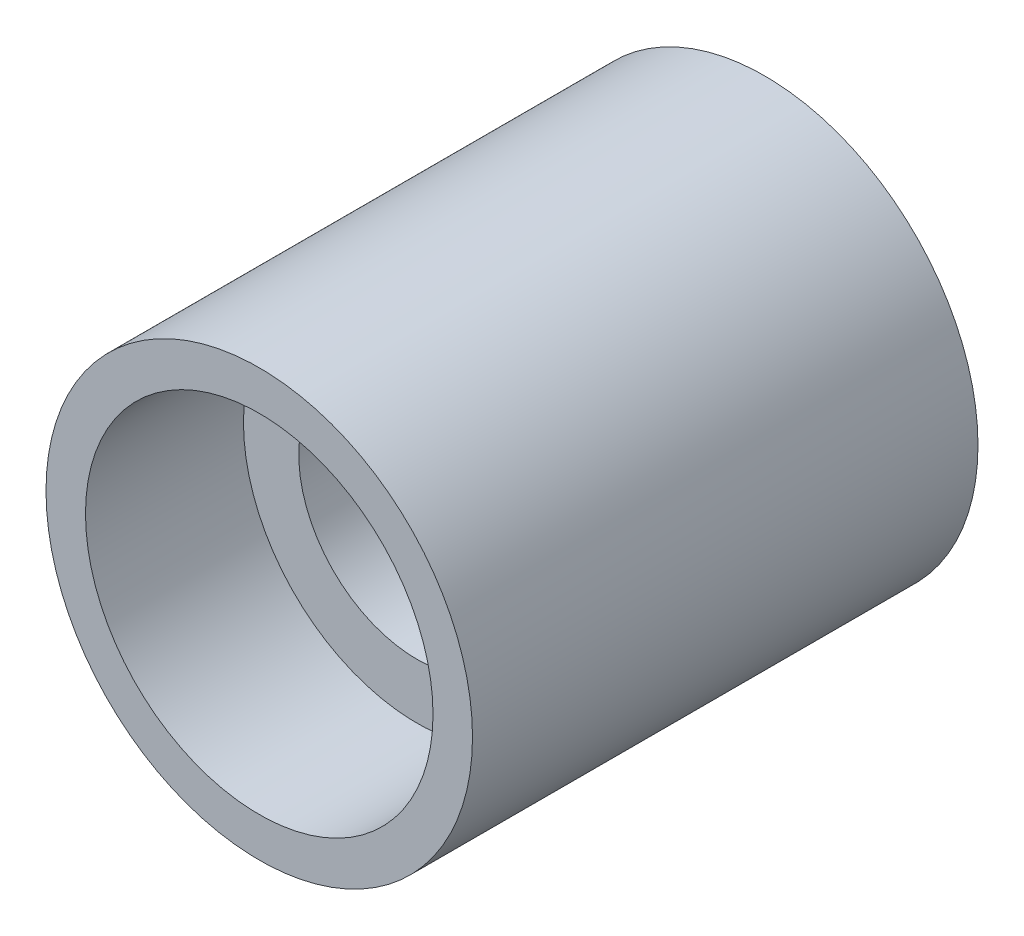
ISO-10303-21;
HEADER;
FILE_DESCRIPTION(('STEP AP214'),'2;1');
FILE_NAME('part.step','',(''),(''),'','','');
FILE_SCHEMA(('AUTOMOTIVE_DESIGN { 1 0 10303 214 1 1 1 1 }'));
ENDSEC;
DATA;
#1=APPLICATION_CONTEXT('core data for automotive mechanical design processes');
#2=APPLICATION_PROTOCOL_DEFINITION('international standard','automotive_design',2000,#1);
#3=PRODUCT_CONTEXT('',#1,'mechanical');
#4=PRODUCT('Part','Part','',(#3));
#5=PRODUCT_RELATED_PRODUCT_CATEGORY('part','',(#4));
#6=PRODUCT_DEFINITION_FORMATION('','',#4);
#7=PRODUCT_DEFINITION_CONTEXT('part definition',#1,'design');
#8=PRODUCT_DEFINITION('design','',#6,#7);
#9=PRODUCT_DEFINITION_SHAPE('','',#8);
#10=(LENGTH_UNIT() NAMED_UNIT(*) SI_UNIT(.MILLI.,.METRE.));
#11=(NAMED_UNIT(*) PLANE_ANGLE_UNIT() SI_UNIT($,.RADIAN.));
#12=(NAMED_UNIT(*) SI_UNIT($,.STERADIAN.) SOLID_ANGLE_UNIT());
#13=UNCERTAINTY_MEASURE_WITH_UNIT(LENGTH_MEASURE(1.E-05),#10,'distance_accuracy_value','');
#14=(GEOMETRIC_REPRESENTATION_CONTEXT(3) GLOBAL_UNCERTAINTY_ASSIGNED_CONTEXT((#13)) GLOBAL_UNIT_ASSIGNED_CONTEXT((#10,
#11,#12)) REPRESENTATION_CONTEXT('',''));
#15=CARTESIAN_POINT('',(0.,0.,0.));
#16=DIRECTION('',(0.,0.,1.));
#17=DIRECTION('',(1.,0.,0.));
#18=AXIS2_PLACEMENT_3D('',#15,#16,#17);
#19=CARTESIAN_POINT('',(0.,0.,-32.));
#20=DIRECTION('',(0.,0.,1.));
#21=DIRECTION('',(1.,0.,0.));
#22=AXIS2_PLACEMENT_3D('',#19,#20,#21);
#23=CYLINDRICAL_SURFACE('',#22,13.5);
#24=CARTESIAN_POINT('',(0.,0.,-32.));
#25=DIRECTION('',(0.,0.,1.));
#26=DIRECTION('',(1.,0.,0.));
#27=AXIS2_PLACEMENT_3D('',#24,#25,#26);
#28=CIRCLE('',#27,13.5);
#29=CARTESIAN_POINT('',(13.5,0.,-32.));
#30=VERTEX_POINT('',#29);
#31=EDGE_CURVE('E10',#30,#30,#28,.T.);
#32=ORIENTED_EDGE('',*,*,#31,.T.);
#33=EDGE_LOOP('',(#32));
#34=FACE_BOUND('',#33,.T.);
#35=CARTESIAN_POINT('',(0.,0.,0.));
#36=DIRECTION('',(0.,0.,1.));
#37=DIRECTION('',(1.,0.,0.));
#38=AXIS2_PLACEMENT_3D('',#35,#36,#37);
#39=CIRCLE('',#38,13.5);
#40=CARTESIAN_POINT('',(13.5,0.,0.));
#41=VERTEX_POINT('',#40);
#42=EDGE_CURVE('E41',#41,#41,#39,.T.);
#43=ORIENTED_EDGE('',*,*,#42,.F.);
#44=EDGE_LOOP('',(#43));
#45=FACE_BOUND('',#44,.T.);
#46=ADVANCED_FACE('F34',(#34,#45),#23,.T.);
#47=CARTESIAN_POINT('',(0.,0.,-32.));
#48=DIRECTION('',(0.,0.,1.));
#49=DIRECTION('',(1.,0.,0.));
#50=AXIS2_PLACEMENT_3D('',#47,#48,#49);
#51=PLANE('',#50);
#52=ORIENTED_EDGE('',*,*,#31,.F.);
#53=EDGE_LOOP('',(#52));
#54=FACE_BOUND('',#53,.T.);
#55=ADVANCED_FACE('F78',(#54),#51,.F.);
#56=CARTESIAN_POINT('',(0.,0.,0.));
#57=DIRECTION('',(0.,0.,1.));
#58=DIRECTION('',(1.,0.,0.));
#59=AXIS2_PLACEMENT_3D('',#56,#57,#58);
#60=PLANE('',#59);
#61=CARTESIAN_POINT('',(0.,0.,0.));
#62=DIRECTION('',(0.,0.,1.));
#63=DIRECTION('',(1.,0.,0.));
#64=AXIS2_PLACEMENT_3D('',#61,#62,#63);
#65=CIRCLE('',#64,11.);
#66=CARTESIAN_POINT('',(11.,0.,0.));
#67=VERTEX_POINT('',#66);
#68=EDGE_CURVE('E48',#67,#67,#65,.T.);
#69=ORIENTED_EDGE('',*,*,#68,.F.);
#70=EDGE_LOOP('',(#69));
#71=FACE_BOUND('',#70,.T.);
#72=ORIENTED_EDGE('',*,*,#42,.T.);
#73=EDGE_LOOP('',(#72));
#74=FACE_BOUND('',#73,.T.);
#75=ADVANCED_FACE('F72',(#71,#74),#60,.T.);
#76=CARTESIAN_POINT('',(0.,0.,-10.));
#77=DIRECTION('',(0.,0.,1.));
#78=DIRECTION('',(1.,0.,0.));
#79=AXIS2_PLACEMENT_3D('',#76,#77,#78);
#80=CYLINDRICAL_SURFACE('',#79,11.);
#81=CARTESIAN_POINT('',(0.,0.,-10.));
#82=DIRECTION('',(0.,0.,1.));
#83=DIRECTION('',(1.,0.,0.));
#84=AXIS2_PLACEMENT_3D('',#81,#82,#83);
#85=CIRCLE('',#84,11.);
#86=CARTESIAN_POINT('',(11.,0.,-10.));
#87=VERTEX_POINT('',#86);
#88=EDGE_CURVE('E46',#87,#87,#85,.T.);
#89=ORIENTED_EDGE('',*,*,#88,.F.);
#90=EDGE_LOOP('',(#89));
#91=FACE_BOUND('',#90,.T.);
#92=ORIENTED_EDGE('',*,*,#68,.T.);
#93=EDGE_LOOP('',(#92));
#94=FACE_BOUND('',#93,.T.);
#95=ADVANCED_FACE('F66',(#91,#94),#80,.F.);
#96=CARTESIAN_POINT('',(0.,0.,-10.));
#97=DIRECTION('',(0.,0.,1.));
#98=DIRECTION('',(1.,0.,0.));
#99=AXIS2_PLACEMENT_3D('',#96,#97,#98);
#100=PLANE('',#99);
#101=CARTESIAN_POINT('',(0.,0.,-10.));
#102=DIRECTION('',(0.,0.,1.));
#103=DIRECTION('',(1.,0.,0.));
#104=AXIS2_PLACEMENT_3D('',#101,#102,#103);
#105=CIRCLE('',#104,7.5);
#106=CARTESIAN_POINT('',(7.5,0.,-10.));
#107=VERTEX_POINT('',#106);
#108=EDGE_CURVE('E37',#107,#107,#105,.T.);
#109=ORIENTED_EDGE('',*,*,#108,.F.);
#110=EDGE_LOOP('',(#109));
#111=FACE_BOUND('',#110,.T.);
#112=ORIENTED_EDGE('',*,*,#88,.T.);
#113=EDGE_LOOP('',(#112));
#114=FACE_BOUND('',#113,.T.);
#115=ADVANCED_FACE('F63',(#111,#114),#100,.T.);
#116=CARTESIAN_POINT('',(0.,0.,-30.));
#117=DIRECTION('',(0.,0.,1.));
#118=DIRECTION('',(1.,0.,0.));
#119=AXIS2_PLACEMENT_3D('',#116,#117,#118);
#120=CYLINDRICAL_SURFACE('',#119,7.5);
#121=ORIENTED_EDGE('',*,*,#108,.T.);
#122=EDGE_LOOP('',(#121));
#123=FACE_BOUND('',#122,.T.);
#124=CARTESIAN_POINT('',(0.,0.,-30.));
#125=DIRECTION('',(0.,0.,1.));
#126=DIRECTION('',(1.,0.,0.));
#127=AXIS2_PLACEMENT_3D('',#124,#125,#126);
#128=CIRCLE('',#127,7.5);
#129=CARTESIAN_POINT('',(7.5,0.,-30.));
#130=VERTEX_POINT('',#129);
#131=EDGE_CURVE('E53',#130,#130,#128,.T.);
#132=ORIENTED_EDGE('',*,*,#131,.F.);
#133=EDGE_LOOP('',(#132));
#134=FACE_BOUND('',#133,.T.);
#135=ADVANCED_FACE('F60',(#123,#134),#120,.F.);
#136=CARTESIAN_POINT('',(0.,0.,-30.));
#137=DIRECTION('',(0.,0.,1.));
#138=DIRECTION('',(1.,0.,0.));
#139=AXIS2_PLACEMENT_3D('',#136,#137,#138);
#140=PLANE('',#139);
#141=ORIENTED_EDGE('',*,*,#131,.T.);
#142=EDGE_LOOP('',(#141));
#143=FACE_BOUND('',#142,.T.);
#144=ADVANCED_FACE('F92',(#143),#140,.T.);
#145=CLOSED_SHELL('',(#46,#55,#75,#95,#115,#135,#144));
#146=MANIFOLD_SOLID_BREP('B2',#145);
#147=ADVANCED_BREP_SHAPE_REPRESENTATION('',(#18,#146),#14);
#148=SHAPE_DEFINITION_REPRESENTATION(#9,#147);
ENDSEC;
END-ISO-10303-21;
